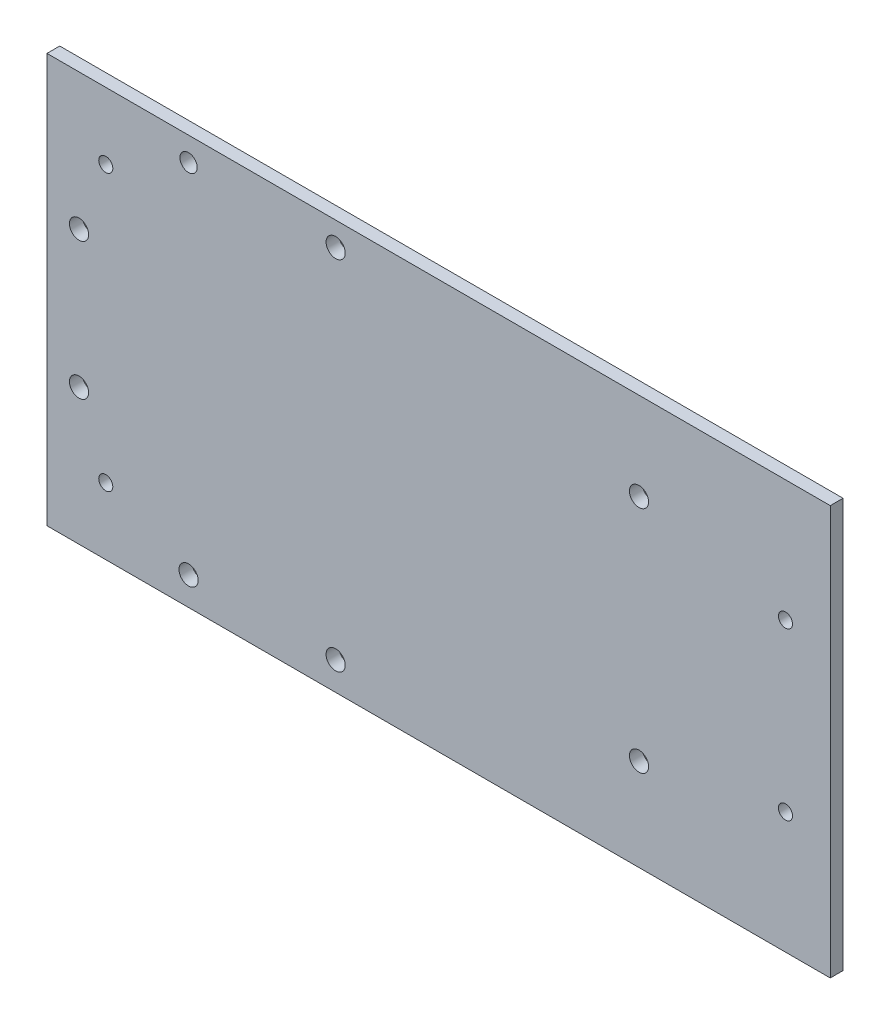
ISO-10303-21;
HEADER;
FILE_DESCRIPTION(('STEP AP214'),'2;1');
FILE_NAME('part.step','',(''),(''),'','','');
FILE_SCHEMA(('AUTOMOTIVE_DESIGN { 1 0 10303 214 1 1 1 1 }'));
ENDSEC;
DATA;
#1=APPLICATION_CONTEXT('core data for automotive mechanical design processes');
#2=APPLICATION_PROTOCOL_DEFINITION('international standard','automotive_design',2000,#1);
#3=PRODUCT_CONTEXT('',#1,'mechanical');
#4=PRODUCT('Part','Part','',(#3));
#5=PRODUCT_RELATED_PRODUCT_CATEGORY('part','',(#4));
#6=PRODUCT_DEFINITION_FORMATION('','',#4);
#7=PRODUCT_DEFINITION_CONTEXT('part definition',#1,'design');
#8=PRODUCT_DEFINITION('design','',#6,#7);
#9=PRODUCT_DEFINITION_SHAPE('','',#8);
#10=(LENGTH_UNIT() NAMED_UNIT(*) SI_UNIT(.MILLI.,.METRE.));
#11=(NAMED_UNIT(*) PLANE_ANGLE_UNIT() SI_UNIT($,.RADIAN.));
#12=(NAMED_UNIT(*) SI_UNIT($,.STERADIAN.) SOLID_ANGLE_UNIT());
#13=UNCERTAINTY_MEASURE_WITH_UNIT(LENGTH_MEASURE(1.E-05),#10,'distance_accuracy_value','');
#14=(GEOMETRIC_REPRESENTATION_CONTEXT(3) GLOBAL_UNCERTAINTY_ASSIGNED_CONTEXT((#13)) GLOBAL_UNIT_ASSIGNED_CONTEXT((#10,
#11,#12)) REPRESENTATION_CONTEXT('',''));
#15=CARTESIAN_POINT('',(0.,0.,0.));
#16=DIRECTION('',(0.,0.,1.));
#17=DIRECTION('',(1.,0.,0.));
#18=AXIS2_PLACEMENT_3D('',#15,#16,#17);
#19=CARTESIAN_POINT('',(153.175,133.195652173913,5.));
#20=DIRECTION('',(-1.,0.,0.));
#21=DIRECTION('',(0.,0.,1.));
#22=AXIS2_PLACEMENT_3D('',#19,#20,#21);
#23=PLANE('',#22);
#24=DIRECTION('',(0.,1.,0.));
#25=VECTOR('',#24,1.);
#26=CARTESIAN_POINT('',(153.175,133.195652173913,0.));
#27=LINE('',#26,#25);
#28=CARTESIAN_POINT('',(153.175,-26.804347826087,0.));
#29=VERTEX_POINT('',#28);
#30=CARTESIAN_POINT('',(153.175,133.195652173913,0.));
#31=VERTEX_POINT('',#30);
#32=EDGE_CURVE('E111',#29,#31,#27,.T.);
#33=ORIENTED_EDGE('',*,*,#32,.T.);
#34=DIRECTION('',(0.,0.,-1.));
#35=VECTOR('',#34,1.);
#36=CARTESIAN_POINT('',(153.175,133.195652173913,5.));
#37=LINE('',#36,#35);
#38=CARTESIAN_POINT('',(153.175,133.195652173913,5.));
#39=VERTEX_POINT('',#38);
#40=EDGE_CURVE('E11',#39,#31,#37,.T.);
#41=ORIENTED_EDGE('',*,*,#40,.F.);
#42=DIRECTION('',(0.,1.,0.));
#43=VECTOR('',#42,1.);
#44=CARTESIAN_POINT('',(153.175,133.195652173913,5.));
#45=LINE('',#44,#43);
#46=CARTESIAN_POINT('',(153.175,-26.804347826087,5.));
#47=VERTEX_POINT('',#46);
#48=EDGE_CURVE('E95',#47,#39,#45,.T.);
#49=ORIENTED_EDGE('',*,*,#48,.F.);
#50=DIRECTION('',(0.,0.,-1.));
#51=VECTOR('',#50,1.);
#52=CARTESIAN_POINT('',(153.175,-26.804347826087,5.));
#53=LINE('',#52,#51);
#54=EDGE_CURVE('E107',#47,#29,#53,.T.);
#55=ORIENTED_EDGE('',*,*,#54,.T.);
#56=EDGE_LOOP('',(#33,#41,#49,#55));
#57=FACE_BOUND('',#56,.T.);
#58=ADVANCED_FACE('F43',(#57),#23,.F.);
#59=CARTESIAN_POINT('',(-153.175,133.195652173913,5.));
#60=DIRECTION('',(0.,-1.,0.));
#61=DIRECTION('',(0.,0.,-1.));
#62=AXIS2_PLACEMENT_3D('',#59,#60,#61);
#63=PLANE('',#62);
#64=DIRECTION('',(-1.,0.,0.));
#65=VECTOR('',#64,1.);
#66=CARTESIAN_POINT('',(-153.175,133.195652173913,0.));
#67=LINE('',#66,#65);
#68=CARTESIAN_POINT('',(-153.175,133.195652173913,0.));
#69=VERTEX_POINT('',#68);
#70=EDGE_CURVE('E100',#31,#69,#67,.T.);
#71=ORIENTED_EDGE('',*,*,#70,.T.);
#72=DIRECTION('',(0.,0.,-1.));
#73=VECTOR('',#72,1.);
#74=CARTESIAN_POINT('',(-153.175,133.195652173913,5.));
#75=LINE('',#74,#73);
#76=CARTESIAN_POINT('',(-153.175,133.195652173913,5.));
#77=VERTEX_POINT('',#76);
#78=EDGE_CURVE('E52',#77,#69,#75,.T.);
#79=ORIENTED_EDGE('',*,*,#78,.F.);
#80=DIRECTION('',(-1.,0.,0.));
#81=VECTOR('',#80,1.);
#82=CARTESIAN_POINT('',(-153.175,133.195652173913,5.));
#83=LINE('',#82,#81);
#84=EDGE_CURVE('E90',#39,#77,#83,.T.);
#85=ORIENTED_EDGE('',*,*,#84,.F.);
#86=ORIENTED_EDGE('',*,*,#40,.T.);
#87=EDGE_LOOP('',(#71,#79,#85,#86));
#88=FACE_BOUND('',#87,.T.);
#89=ADVANCED_FACE('F99',(#88),#63,.F.);
#90=CARTESIAN_POINT('',(-153.175,133.195652173913,5.));
#91=DIRECTION('',(1.,0.,0.));
#92=DIRECTION('',(0.,0.,-1.));
#93=AXIS2_PLACEMENT_3D('',#90,#91,#92);
#94=PLANE('',#93);
#95=DIRECTION('',(0.,-1.,0.));
#96=VECTOR('',#95,1.);
#97=CARTESIAN_POINT('',(-153.175,133.195652173913,0.));
#98=LINE('',#97,#96);
#99=CARTESIAN_POINT('',(-153.175,-26.804347826087,0.));
#100=VERTEX_POINT('',#99);
#101=EDGE_CURVE('E77',#69,#100,#98,.T.);
#102=ORIENTED_EDGE('',*,*,#101,.T.);
#103=DIRECTION('',(0.,0.,-1.));
#104=VECTOR('',#103,1.);
#105=CARTESIAN_POINT('',(-153.175,-26.804347826087,5.));
#106=LINE('',#105,#104);
#107=CARTESIAN_POINT('',(-153.175,-26.804347826087,5.));
#108=VERTEX_POINT('',#107);
#109=EDGE_CURVE('E102',#108,#100,#106,.T.);
#110=ORIENTED_EDGE('',*,*,#109,.F.);
#111=DIRECTION('',(0.,-1.,0.));
#112=VECTOR('',#111,1.);
#113=CARTESIAN_POINT('',(-153.175,133.195652173913,5.));
#114=LINE('',#113,#112);
#115=EDGE_CURVE('E93',#77,#108,#114,.T.);
#116=ORIENTED_EDGE('',*,*,#115,.F.);
#117=ORIENTED_EDGE('',*,*,#78,.T.);
#118=EDGE_LOOP('',(#102,#110,#116,#117));
#119=FACE_BOUND('',#118,.T.);
#120=ADVANCED_FACE('F103',(#119),#94,.F.);
#121=CARTESIAN_POINT('',(-153.175,-26.804347826087,5.));
#122=DIRECTION('',(0.,1.,0.));
#123=DIRECTION('',(-1.,0.,0.));
#124=AXIS2_PLACEMENT_3D('',#121,#122,#123);
#125=PLANE('',#124);
#126=DIRECTION('',(1.,0.,0.));
#127=VECTOR('',#126,1.);
#128=CARTESIAN_POINT('',(-153.175,-26.804347826087,0.));
#129=LINE('',#128,#127);
#130=EDGE_CURVE('E83',#100,#29,#129,.T.);
#131=ORIENTED_EDGE('',*,*,#130,.T.);
#132=ORIENTED_EDGE('',*,*,#54,.F.);
#133=DIRECTION('',(1.,0.,0.));
#134=VECTOR('',#133,1.);
#135=CARTESIAN_POINT('',(-153.175,-26.804347826087,5.));
#136=LINE('',#135,#134);
#137=EDGE_CURVE('E60',#108,#47,#136,.T.);
#138=ORIENTED_EDGE('',*,*,#137,.F.);
#139=ORIENTED_EDGE('',*,*,#109,.T.);
#140=EDGE_LOOP('',(#131,#132,#138,#139));
#141=FACE_BOUND('',#140,.T.);
#142=ADVANCED_FACE('F125',(#141),#125,.F.);
#143=CARTESIAN_POINT('',(0.,0.,5.));
#144=DIRECTION('',(0.,0.,1.));
#145=DIRECTION('',(1.,0.,0.));
#146=AXIS2_PLACEMENT_3D('',#143,#144,#145);
#147=PLANE('',#146);
#148=CARTESIAN_POINT('',(-130.175,-0.704347826086953,5.));
#149=DIRECTION('',(0.,0.,-1.));
#150=DIRECTION('',(-1.,0.,0.));
#151=AXIS2_PLACEMENT_3D('',#148,#149,#150);
#152=CIRCLE('',#151,2.75000000000001);
#153=CARTESIAN_POINT('',(-132.925,-0.704347826086953,5.));
#154=VERTEX_POINT('',#153);
#155=EDGE_CURVE('E204',#154,#154,#152,.T.);
#156=ORIENTED_EDGE('',*,*,#155,.T.);
#157=EDGE_LOOP('',(#156));
#158=FACE_BOUND('',#157,.T.);
#159=CARTESIAN_POINT('',(-130.175,107.095652173913,5.));
#160=DIRECTION('',(0.,0.,-1.));
#161=DIRECTION('',(-1.,0.,0.));
#162=AXIS2_PLACEMENT_3D('',#159,#160,#161);
#163=CIRCLE('',#162,2.75000000000001);
#164=CARTESIAN_POINT('',(-132.925,107.095652173913,5.));
#165=VERTEX_POINT('',#164);
#166=EDGE_CURVE('E212',#165,#165,#163,.T.);
#167=ORIENTED_EDGE('',*,*,#166,.T.);
#168=EDGE_LOOP('',(#167));
#169=FACE_BOUND('',#168,.T.);
#170=CARTESIAN_POINT('',(135.665,85.695652173913,5.));
#171=DIRECTION('',(0.,0.,-1.));
#172=DIRECTION('',(-1.,0.,0.));
#173=AXIS2_PLACEMENT_3D('',#170,#171,#172);
#174=CIRCLE('',#173,2.75000000000001);
#175=CARTESIAN_POINT('',(132.915,85.695652173913,5.));
#176=VERTEX_POINT('',#175);
#177=EDGE_CURVE('E220',#176,#176,#174,.T.);
#178=ORIENTED_EDGE('',*,*,#177,.T.);
#179=EDGE_LOOP('',(#178));
#180=FACE_BOUND('',#179,.T.);
#181=CARTESIAN_POINT('',(135.665,20.695652173913,5.));
#182=DIRECTION('',(0.,0.,-1.));
#183=DIRECTION('',(-1.,0.,0.));
#184=AXIS2_PLACEMENT_3D('',#181,#182,#183);
#185=CIRCLE('',#184,2.75000000000001);
#186=CARTESIAN_POINT('',(132.915,20.695652173913,5.));
#187=VERTEX_POINT('',#186);
#188=EDGE_CURVE('E192',#187,#187,#185,.T.);
#189=ORIENTED_EDGE('',*,*,#188,.T.);
#190=EDGE_LOOP('',(#189));
#191=FACE_BOUND('',#190,.T.);
#192=CARTESIAN_POINT('',(-97.795,123.895652173913,5.));
#193=DIRECTION('',(0.,0.,-1.));
#194=DIRECTION('',(-1.,0.,0.));
#195=AXIS2_PLACEMENT_3D('',#192,#193,#194);
#196=CIRCLE('',#195,3.37238590964364);
#197=CARTESIAN_POINT('',(-101.167385909644,123.895652173913,5.));
#198=VERTEX_POINT('',#197);
#199=EDGE_CURVE('E156',#198,#198,#196,.T.);
#200=ORIENTED_EDGE('',*,*,#199,.T.);
#201=EDGE_LOOP('',(#200));
#202=FACE_BOUND('',#201,.T.);
#203=CARTESIAN_POINT('',(-40.265,-15.754347826087,5.));
#204=DIRECTION('',(0.,0.,-1.));
#205=DIRECTION('',(-1.,0.,0.));
#206=AXIS2_PLACEMENT_3D('',#203,#204,#205);
#207=CIRCLE('',#206,3.75000000000001);
#208=CARTESIAN_POINT('',(-44.015,-15.754347826087,5.));
#209=VERTEX_POINT('',#208);
#210=EDGE_CURVE('E165',#209,#209,#207,.T.);
#211=ORIENTED_EDGE('',*,*,#210,.T.);
#212=EDGE_LOOP('',(#211));
#213=FACE_BOUND('',#212,.T.);
#214=CARTESIAN_POINT('',(-97.795,-15.754347826087,5.));
#215=DIRECTION('',(0.,0.,-1.));
#216=DIRECTION('',(-1.,0.,0.));
#217=AXIS2_PLACEMENT_3D('',#214,#215,#216);
#218=CIRCLE('',#217,3.75000000000001);
#219=CARTESIAN_POINT('',(-101.545,-15.754347826087,5.));
#220=VERTEX_POINT('',#219);
#221=EDGE_CURVE('E140',#220,#220,#218,.T.);
#222=ORIENTED_EDGE('',*,*,#221,.T.);
#223=EDGE_LOOP('',(#222));
#224=FACE_BOUND('',#223,.T.);
#225=CARTESIAN_POINT('',(-140.6297,79.946852173913,5.));
#226=DIRECTION('',(0.,0.,-1.));
#227=DIRECTION('',(-1.,0.,0.));
#228=AXIS2_PLACEMENT_3D('',#225,#226,#227);
#229=CIRCLE('',#228,3.75000000000001);
#230=CARTESIAN_POINT('',(-144.3797,79.946852173913,5.));
#231=VERTEX_POINT('',#230);
#232=EDGE_CURVE('E149',#231,#231,#229,.T.);
#233=ORIENTED_EDGE('',*,*,#232,.T.);
#234=EDGE_LOOP('',(#233));
#235=FACE_BOUND('',#234,.T.);
#236=CARTESIAN_POINT('',(78.375,98.895652173913,5.));
#237=DIRECTION('',(0.,0.,-1.));
#238=DIRECTION('',(-1.,0.,0.));
#239=AXIS2_PLACEMENT_3D('',#236,#237,#238);
#240=CIRCLE('',#239,3.75000000000001);
#241=CARTESIAN_POINT('',(74.625,98.895652173913,5.));
#242=VERTEX_POINT('',#241);
#243=EDGE_CURVE('E188',#242,#242,#240,.T.);
#244=ORIENTED_EDGE('',*,*,#243,.T.);
#245=EDGE_LOOP('',(#244));
#246=FACE_BOUND('',#245,.T.);
#247=CARTESIAN_POINT('',(78.375,9.24565217391303,5.));
#248=DIRECTION('',(0.,0.,-1.));
#249=DIRECTION('',(-1.,0.,0.));
#250=AXIS2_PLACEMENT_3D('',#247,#248,#249);
#251=CIRCLE('',#250,3.75000000000001);
#252=CARTESIAN_POINT('',(74.625,9.24565217391303,5.));
#253=VERTEX_POINT('',#252);
#254=EDGE_CURVE('E172',#253,#253,#251,.T.);
#255=ORIENTED_EDGE('',*,*,#254,.T.);
#256=EDGE_LOOP('',(#255));
#257=FACE_BOUND('',#256,.T.);
#258=CARTESIAN_POINT('',(-40.265,123.895652173913,5.));
#259=DIRECTION('',(0.,0.,-1.));
#260=DIRECTION('',(-1.,0.,0.));
#261=AXIS2_PLACEMENT_3D('',#258,#259,#260);
#262=CIRCLE('',#261,3.75000000000001);
#263=CARTESIAN_POINT('',(-44.015,123.895652173913,5.));
#264=VERTEX_POINT('',#263);
#265=EDGE_CURVE('E181',#264,#264,#262,.T.);
#266=ORIENTED_EDGE('',*,*,#265,.T.);
#267=EDGE_LOOP('',(#266));
#268=FACE_BOUND('',#267,.T.);
#269=CARTESIAN_POINT('',(-140.6297,26.4444521739131,5.));
#270=DIRECTION('',(0.,0.,-1.));
#271=DIRECTION('',(-1.,0.,0.));
#272=AXIS2_PLACEMENT_3D('',#269,#270,#271);
#273=CIRCLE('',#272,3.75000000000001);
#274=CARTESIAN_POINT('',(-144.3797,26.4444521739131,5.));
#275=VERTEX_POINT('',#274);
#276=EDGE_CURVE('E115',#275,#275,#273,.T.);
#277=ORIENTED_EDGE('',*,*,#276,.T.);
#278=EDGE_LOOP('',(#277));
#279=FACE_BOUND('',#278,.T.);
#280=ORIENTED_EDGE('',*,*,#48,.T.);
#281=ORIENTED_EDGE('',*,*,#84,.T.);
#282=ORIENTED_EDGE('',*,*,#115,.T.);
#283=ORIENTED_EDGE('',*,*,#137,.T.);
#284=EDGE_LOOP('',(#280,#281,#282,#283));
#285=FACE_BOUND('',#284,.T.);
#286=ADVANCED_FACE('F91',(#158,#169,#180,#191,#202,#213,#224,#235,#246,#257,#268,#279,#285),
#147,.T.);
#287=CARTESIAN_POINT('',(0.,0.,0.));
#288=DIRECTION('',(0.,0.,1.));
#289=DIRECTION('',(1.,0.,0.));
#290=AXIS2_PLACEMENT_3D('',#287,#288,#289);
#291=PLANE('',#290);
#292=CARTESIAN_POINT('',(-130.175,-0.704347826086953,0.));
#293=DIRECTION('',(0.,0.,-1.));
#294=DIRECTION('',(-1.,0.,0.));
#295=AXIS2_PLACEMENT_3D('',#292,#293,#294);
#296=CIRCLE('',#295,2.75000000000001);
#297=CARTESIAN_POINT('',(-132.925,-0.704347826086953,0.));
#298=VERTEX_POINT('',#297);
#299=EDGE_CURVE('E208',#298,#298,#296,.T.);
#300=ORIENTED_EDGE('',*,*,#299,.F.);
#301=EDGE_LOOP('',(#300));
#302=FACE_BOUND('',#301,.T.);
#303=CARTESIAN_POINT('',(-130.175,107.095652173913,0.));
#304=DIRECTION('',(0.,0.,-1.));
#305=DIRECTION('',(-1.,0.,0.));
#306=AXIS2_PLACEMENT_3D('',#303,#304,#305);
#307=CIRCLE('',#306,2.75000000000001);
#308=CARTESIAN_POINT('',(-132.925,107.095652173913,0.));
#309=VERTEX_POINT('',#308);
#310=EDGE_CURVE('E216',#309,#309,#307,.T.);
#311=ORIENTED_EDGE('',*,*,#310,.F.);
#312=EDGE_LOOP('',(#311));
#313=FACE_BOUND('',#312,.T.);
#314=CARTESIAN_POINT('',(135.665,85.695652173913,0.));
#315=DIRECTION('',(0.,0.,-1.));
#316=DIRECTION('',(-1.,0.,0.));
#317=AXIS2_PLACEMENT_3D('',#314,#315,#316);
#318=CIRCLE('',#317,2.75000000000001);
#319=CARTESIAN_POINT('',(132.915,85.695652173913,0.));
#320=VERTEX_POINT('',#319);
#321=EDGE_CURVE('E200',#320,#320,#318,.T.);
#322=ORIENTED_EDGE('',*,*,#321,.F.);
#323=EDGE_LOOP('',(#322));
#324=FACE_BOUND('',#323,.T.);
#325=CARTESIAN_POINT('',(135.665,20.695652173913,0.));
#326=DIRECTION('',(0.,0.,-1.));
#327=DIRECTION('',(-1.,0.,0.));
#328=AXIS2_PLACEMENT_3D('',#325,#326,#327);
#329=CIRCLE('',#328,2.75000000000001);
#330=CARTESIAN_POINT('',(132.915,20.695652173913,0.));
#331=VERTEX_POINT('',#330);
#332=EDGE_CURVE('E196',#331,#331,#329,.T.);
#333=ORIENTED_EDGE('',*,*,#332,.F.);
#334=EDGE_LOOP('',(#333));
#335=FACE_BOUND('',#334,.T.);
#336=CARTESIAN_POINT('',(-97.795,123.895652173913,0.));
#337=DIRECTION('',(0.,0.,-1.));
#338=DIRECTION('',(-1.,0.,0.));
#339=AXIS2_PLACEMENT_3D('',#336,#337,#338);
#340=CIRCLE('',#339,3.37238590964364);
#341=CARTESIAN_POINT('',(-101.167385909644,123.895652173913,0.));
#342=VERTEX_POINT('',#341);
#343=EDGE_CURVE('E160',#342,#342,#340,.T.);
#344=ORIENTED_EDGE('',*,*,#343,.F.);
#345=EDGE_LOOP('',(#344));
#346=FACE_BOUND('',#345,.T.);
#347=CARTESIAN_POINT('',(-40.265,-15.754347826087,0.));
#348=DIRECTION('',(0.,0.,-1.));
#349=DIRECTION('',(-1.,0.,0.));
#350=AXIS2_PLACEMENT_3D('',#347,#348,#349);
#351=CIRCLE('',#350,3.75000000000001);
#352=CARTESIAN_POINT('',(-44.015,-15.754347826087,0.));
#353=VERTEX_POINT('',#352);
#354=EDGE_CURVE('E145',#353,#353,#351,.T.);
#355=ORIENTED_EDGE('',*,*,#354,.F.);
#356=EDGE_LOOP('',(#355));
#357=FACE_BOUND('',#356,.T.);
#358=CARTESIAN_POINT('',(-97.795,-15.754347826087,0.));
#359=DIRECTION('',(0.,0.,-1.));
#360=DIRECTION('',(-1.,0.,0.));
#361=AXIS2_PLACEMENT_3D('',#358,#359,#360);
#362=CIRCLE('',#361,3.75000000000001);
#363=CARTESIAN_POINT('',(-101.545,-15.754347826087,0.));
#364=VERTEX_POINT('',#363);
#365=EDGE_CURVE('E144',#364,#364,#362,.T.);
#366=ORIENTED_EDGE('',*,*,#365,.F.);
#367=EDGE_LOOP('',(#366));
#368=FACE_BOUND('',#367,.T.);
#369=CARTESIAN_POINT('',(-140.6297,79.946852173913,0.));
#370=DIRECTION('',(0.,0.,-1.));
#371=DIRECTION('',(-1.,0.,0.));
#372=AXIS2_PLACEMENT_3D('',#369,#370,#371);
#373=CIRCLE('',#372,3.75000000000001);
#374=CARTESIAN_POINT('',(-144.3797,79.946852173913,0.));
#375=VERTEX_POINT('',#374);
#376=EDGE_CURVE('E136',#375,#375,#373,.T.);
#377=ORIENTED_EDGE('',*,*,#376,.F.);
#378=EDGE_LOOP('',(#377));
#379=FACE_BOUND('',#378,.T.);
#380=CARTESIAN_POINT('',(78.375,98.895652173913,0.));
#381=DIRECTION('',(0.,0.,-1.));
#382=DIRECTION('',(-1.,0.,0.));
#383=AXIS2_PLACEMENT_3D('',#380,#381,#382);
#384=CIRCLE('',#383,3.75000000000001);
#385=CARTESIAN_POINT('',(74.625,98.895652173913,0.));
#386=VERTEX_POINT('',#385);
#387=EDGE_CURVE('E177',#386,#386,#384,.T.);
#388=ORIENTED_EDGE('',*,*,#387,.F.);
#389=EDGE_LOOP('',(#388));
#390=FACE_BOUND('',#389,.T.);
#391=CARTESIAN_POINT('',(78.375,9.24565217391303,0.));
#392=DIRECTION('',(0.,0.,-1.));
#393=DIRECTION('',(-1.,0.,0.));
#394=AXIS2_PLACEMENT_3D('',#391,#392,#393);
#395=CIRCLE('',#394,3.75000000000001);
#396=CARTESIAN_POINT('',(74.625,9.24565217391303,0.));
#397=VERTEX_POINT('',#396);
#398=EDGE_CURVE('E176',#397,#397,#395,.T.);
#399=ORIENTED_EDGE('',*,*,#398,.F.);
#400=EDGE_LOOP('',(#399));
#401=FACE_BOUND('',#400,.T.);
#402=CARTESIAN_POINT('',(-40.265,123.895652173913,0.));
#403=DIRECTION('',(0.,0.,-1.));
#404=DIRECTION('',(-1.,0.,0.));
#405=AXIS2_PLACEMENT_3D('',#402,#403,#404);
#406=CIRCLE('',#405,3.75000000000001);
#407=CARTESIAN_POINT('',(-44.015,123.895652173913,0.));
#408=VERTEX_POINT('',#407);
#409=EDGE_CURVE('E161',#408,#408,#406,.T.);
#410=ORIENTED_EDGE('',*,*,#409,.F.);
#411=EDGE_LOOP('',(#410));
#412=FACE_BOUND('',#411,.T.);
#413=CARTESIAN_POINT('',(-140.6297,26.4444521739131,0.));
#414=DIRECTION('',(0.,0.,-1.));
#415=DIRECTION('',(-1.,0.,0.));
#416=AXIS2_PLACEMENT_3D('',#413,#414,#415);
#417=CIRCLE('',#416,3.75000000000001);
#418=CARTESIAN_POINT('',(-144.3797,26.4444521739131,0.));
#419=VERTEX_POINT('',#418);
#420=EDGE_CURVE('E132',#419,#419,#417,.T.);
#421=ORIENTED_EDGE('',*,*,#420,.F.);
#422=EDGE_LOOP('',(#421));
#423=FACE_BOUND('',#422,.T.);
#424=ORIENTED_EDGE('',*,*,#32,.F.);
#425=ORIENTED_EDGE('',*,*,#130,.F.);
#426=ORIENTED_EDGE('',*,*,#101,.F.);
#427=ORIENTED_EDGE('',*,*,#70,.F.);
#428=EDGE_LOOP('',(#424,#425,#426,#427));
#429=FACE_BOUND('',#428,.T.);
#430=ADVANCED_FACE('F128',(#302,#313,#324,#335,#346,#357,#368,#379,#390,#401,#412,#423,#429),
#291,.F.);
#431=CARTESIAN_POINT('',(-140.6297,26.4444521739131,5.));
#432=DIRECTION('',(0.,0.,-1.));
#433=DIRECTION('',(-1.,0.,0.));
#434=AXIS2_PLACEMENT_3D('',#431,#432,#433);
#435=CYLINDRICAL_SURFACE('',#434,3.75000000000001);
#436=ORIENTED_EDGE('',*,*,#276,.F.);
#437=EDGE_LOOP('',(#436));
#438=FACE_BOUND('',#437,.T.);
#439=ORIENTED_EDGE('',*,*,#420,.T.);
#440=EDGE_LOOP('',(#439));
#441=FACE_BOUND('',#440,.T.);
#442=ADVANCED_FACE('F232',(#438,#441),#435,.F.);
#443=CARTESIAN_POINT('',(-40.265,123.895652173913,5.));
#444=DIRECTION('',(0.,0.,-1.));
#445=DIRECTION('',(-1.,0.,0.));
#446=AXIS2_PLACEMENT_3D('',#443,#444,#445);
#447=CYLINDRICAL_SURFACE('',#446,3.75000000000001);
#448=ORIENTED_EDGE('',*,*,#265,.F.);
#449=EDGE_LOOP('',(#448));
#450=FACE_BOUND('',#449,.T.);
#451=ORIENTED_EDGE('',*,*,#409,.T.);
#452=EDGE_LOOP('',(#451));
#453=FACE_BOUND('',#452,.T.);
#454=ADVANCED_FACE('F254',(#450,#453),#447,.F.);
#455=CARTESIAN_POINT('',(78.375,9.24565217391303,5.));
#456=DIRECTION('',(0.,0.,-1.));
#457=DIRECTION('',(-1.,0.,0.));
#458=AXIS2_PLACEMENT_3D('',#455,#456,#457);
#459=CYLINDRICAL_SURFACE('',#458,3.75000000000001);
#460=ORIENTED_EDGE('',*,*,#254,.F.);
#461=EDGE_LOOP('',(#460));
#462=FACE_BOUND('',#461,.T.);
#463=ORIENTED_EDGE('',*,*,#398,.T.);
#464=EDGE_LOOP('',(#463));
#465=FACE_BOUND('',#464,.T.);
#466=ADVANCED_FACE('F260',(#462,#465),#459,.F.);
#467=CARTESIAN_POINT('',(78.375,98.895652173913,5.));
#468=DIRECTION('',(0.,0.,-1.));
#469=DIRECTION('',(-1.,0.,0.));
#470=AXIS2_PLACEMENT_3D('',#467,#468,#469);
#471=CYLINDRICAL_SURFACE('',#470,3.75000000000001);
#472=ORIENTED_EDGE('',*,*,#243,.F.);
#473=EDGE_LOOP('',(#472));
#474=FACE_BOUND('',#473,.T.);
#475=ORIENTED_EDGE('',*,*,#387,.T.);
#476=EDGE_LOOP('',(#475));
#477=FACE_BOUND('',#476,.T.);
#478=ADVANCED_FACE('F306',(#474,#477),#471,.F.);
#479=CARTESIAN_POINT('',(-140.6297,79.946852173913,5.));
#480=DIRECTION('',(0.,0.,-1.));
#481=DIRECTION('',(-1.,0.,0.));
#482=AXIS2_PLACEMENT_3D('',#479,#480,#481);
#483=CYLINDRICAL_SURFACE('',#482,3.75000000000001);
#484=ORIENTED_EDGE('',*,*,#232,.F.);
#485=EDGE_LOOP('',(#484));
#486=FACE_BOUND('',#485,.T.);
#487=ORIENTED_EDGE('',*,*,#376,.T.);
#488=EDGE_LOOP('',(#487));
#489=FACE_BOUND('',#488,.T.);
#490=ADVANCED_FACE('F311',(#486,#489),#483,.F.);
#491=CARTESIAN_POINT('',(-97.795,-15.754347826087,5.));
#492=DIRECTION('',(0.,0.,-1.));
#493=DIRECTION('',(-1.,0.,0.));
#494=AXIS2_PLACEMENT_3D('',#491,#492,#493);
#495=CYLINDRICAL_SURFACE('',#494,3.75000000000001);
#496=ORIENTED_EDGE('',*,*,#221,.F.);
#497=EDGE_LOOP('',(#496));
#498=FACE_BOUND('',#497,.T.);
#499=ORIENTED_EDGE('',*,*,#365,.T.);
#500=EDGE_LOOP('',(#499));
#501=FACE_BOUND('',#500,.T.);
#502=ADVANCED_FACE('F319',(#498,#501),#495,.F.);
#503=CARTESIAN_POINT('',(-40.265,-15.754347826087,5.));
#504=DIRECTION('',(0.,0.,-1.));
#505=DIRECTION('',(-1.,0.,0.));
#506=AXIS2_PLACEMENT_3D('',#503,#504,#505);
#507=CYLINDRICAL_SURFACE('',#506,3.75000000000001);
#508=ORIENTED_EDGE('',*,*,#210,.F.);
#509=EDGE_LOOP('',(#508));
#510=FACE_BOUND('',#509,.T.);
#511=ORIENTED_EDGE('',*,*,#354,.T.);
#512=EDGE_LOOP('',(#511));
#513=FACE_BOUND('',#512,.T.);
#514=ADVANCED_FACE('F315',(#510,#513),#507,.F.);
#515=CARTESIAN_POINT('',(-97.795,123.895652173913,5.));
#516=DIRECTION('',(0.,0.,-1.));
#517=DIRECTION('',(-1.,0.,0.));
#518=AXIS2_PLACEMENT_3D('',#515,#516,#517);
#519=CYLINDRICAL_SURFACE('',#518,3.37238590964364);
#520=ORIENTED_EDGE('',*,*,#199,.F.);
#521=EDGE_LOOP('',(#520));
#522=FACE_BOUND('',#521,.T.);
#523=ORIENTED_EDGE('',*,*,#343,.T.);
#524=EDGE_LOOP('',(#523));
#525=FACE_BOUND('',#524,.T.);
#526=ADVANCED_FACE('F318',(#522,#525),#519,.F.);
#527=CARTESIAN_POINT('',(135.665,20.695652173913,5.));
#528=DIRECTION('',(0.,0.,-1.));
#529=DIRECTION('',(-1.,0.,0.));
#530=AXIS2_PLACEMENT_3D('',#527,#528,#529);
#531=CYLINDRICAL_SURFACE('',#530,2.75000000000001);
#532=ORIENTED_EDGE('',*,*,#188,.F.);
#533=EDGE_LOOP('',(#532));
#534=FACE_BOUND('',#533,.T.);
#535=ORIENTED_EDGE('',*,*,#332,.T.);
#536=EDGE_LOOP('',(#535));
#537=FACE_BOUND('',#536,.T.);
#538=ADVANCED_FACE('F323',(#534,#537),#531,.F.);
#539=CARTESIAN_POINT('',(135.665,85.695652173913,5.));
#540=DIRECTION('',(0.,0.,-1.));
#541=DIRECTION('',(-1.,0.,0.));
#542=AXIS2_PLACEMENT_3D('',#539,#540,#541);
#543=CYLINDRICAL_SURFACE('',#542,2.75000000000001);
#544=ORIENTED_EDGE('',*,*,#177,.F.);
#545=EDGE_LOOP('',(#544));
#546=FACE_BOUND('',#545,.T.);
#547=ORIENTED_EDGE('',*,*,#321,.T.);
#548=EDGE_LOOP('',(#547));
#549=FACE_BOUND('',#548,.T.);
#550=ADVANCED_FACE('F228',(#546,#549),#543,.F.);
#551=CARTESIAN_POINT('',(-130.175,107.095652173913,5.));
#552=DIRECTION('',(0.,0.,-1.));
#553=DIRECTION('',(-1.,0.,0.));
#554=AXIS2_PLACEMENT_3D('',#551,#552,#553);
#555=CYLINDRICAL_SURFACE('',#554,2.75000000000001);
#556=ORIENTED_EDGE('',*,*,#166,.F.);
#557=EDGE_LOOP('',(#556));
#558=FACE_BOUND('',#557,.T.);
#559=ORIENTED_EDGE('',*,*,#310,.T.);
#560=EDGE_LOOP('',(#559));
#561=FACE_BOUND('',#560,.T.);
#562=ADVANCED_FACE('F356',(#558,#561),#555,.F.);
#563=CARTESIAN_POINT('',(-130.175,-0.704347826086953,5.));
#564=DIRECTION('',(0.,0.,-1.));
#565=DIRECTION('',(-1.,0.,0.));
#566=AXIS2_PLACEMENT_3D('',#563,#564,#565);
#567=CYLINDRICAL_SURFACE('',#566,2.75000000000001);
#568=ORIENTED_EDGE('',*,*,#155,.F.);
#569=EDGE_LOOP('',(#568));
#570=FACE_BOUND('',#569,.T.);
#571=ORIENTED_EDGE('',*,*,#299,.T.);
#572=EDGE_LOOP('',(#571));
#573=FACE_BOUND('',#572,.T.);
#574=ADVANCED_FACE('F364',(#570,#573),#567,.F.);
#575=CLOSED_SHELL('',(#58,#89,#120,#142,#286,#430,#442,#454,#466,#478,#490,#502,#514,#526,#538,
#550,#562,#574));
#576=MANIFOLD_SOLID_BREP('B2',#575);
#577=ADVANCED_BREP_SHAPE_REPRESENTATION('',(#18,#576),#14);
#578=SHAPE_DEFINITION_REPRESENTATION(#9,#577);
ENDSEC;
END-ISO-10303-21;
